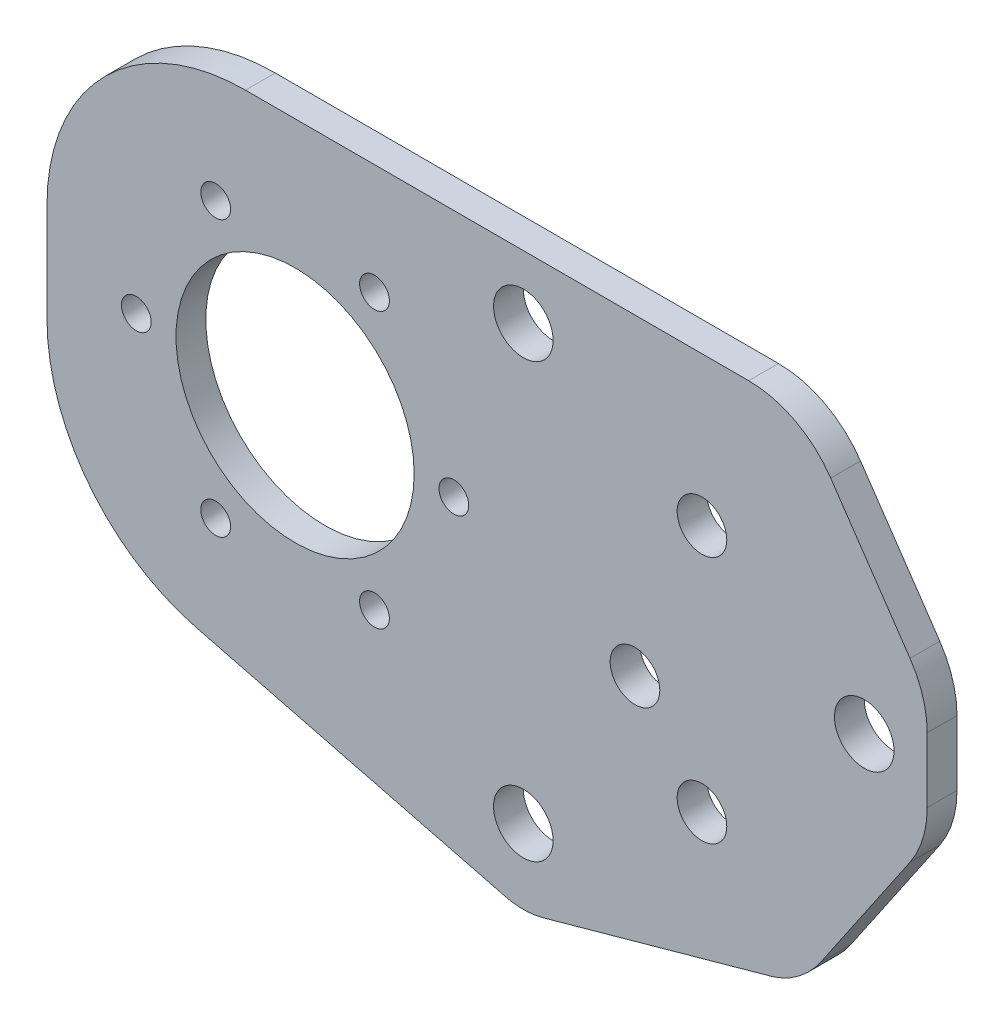
ISO-10303-21;
HEADER;
FILE_DESCRIPTION(('STEP AP214'),'2;1');
FILE_NAME('part.step','',(''),(''),'','','');
FILE_SCHEMA(('AUTOMOTIVE_DESIGN { 1 0 10303 214 1 1 1 1 }'));
ENDSEC;
DATA;
#1=APPLICATION_CONTEXT('core data for automotive mechanical design processes');
#2=APPLICATION_PROTOCOL_DEFINITION('international standard','automotive_design',2000,#1);
#3=PRODUCT_CONTEXT('',#1,'mechanical');
#4=PRODUCT('Part','Part','',(#3));
#5=PRODUCT_RELATED_PRODUCT_CATEGORY('part','',(#4));
#6=PRODUCT_DEFINITION_FORMATION('','',#4);
#7=PRODUCT_DEFINITION_CONTEXT('part definition',#1,'design');
#8=PRODUCT_DEFINITION('design','',#6,#7);
#9=PRODUCT_DEFINITION_SHAPE('','',#8);
#10=(LENGTH_UNIT() NAMED_UNIT(*) SI_UNIT(.MILLI.,.METRE.));
#11=(NAMED_UNIT(*) PLANE_ANGLE_UNIT() SI_UNIT($,.RADIAN.));
#12=(NAMED_UNIT(*) SI_UNIT($,.STERADIAN.) SOLID_ANGLE_UNIT());
#13=UNCERTAINTY_MEASURE_WITH_UNIT(LENGTH_MEASURE(1.E-05),#10,'distance_accuracy_value','');
#14=(GEOMETRIC_REPRESENTATION_CONTEXT(3) GLOBAL_UNCERTAINTY_ASSIGNED_CONTEXT((#13)) GLOBAL_UNIT_ASSIGNED_CONTEXT((#10,
#11,#12)) REPRESENTATION_CONTEXT('',''));
#15=CARTESIAN_POINT('',(0.,0.,0.));
#16=DIRECTION('',(0.,0.,1.));
#17=DIRECTION('',(1.,0.,0.));
#18=AXIS2_PLACEMENT_3D('',#15,#16,#17);
#19=CARTESIAN_POINT('',(20.,20.,3.));
#20=DIRECTION('',(0.,0.,-1.));
#21=DIRECTION('',(-1.,0.,0.));
#22=AXIS2_PLACEMENT_3D('',#19,#20,#21);
#23=CYLINDRICAL_SURFACE('',#22,20.);
#24=CARTESIAN_POINT('',(20.,20.,0.));
#25=DIRECTION('',(0.,0.,-1.));
#26=DIRECTION('',(-1.,0.,0.));
#27=AXIS2_PLACEMENT_3D('',#24,#25,#26);
#28=CIRCLE('',#27,20.);
#29=CARTESIAN_POINT('',(15.0815742554658,0.614203957652305,0.));
#30=VERTEX_POINT('',#29);
#31=CARTESIAN_POINT('',(0.,20.,0.));
#32=VERTEX_POINT('',#31);
#33=EDGE_CURVE('E327',#30,#32,#28,.T.);
#34=ORIENTED_EDGE('',*,*,#33,.F.);
#35=DIRECTION('',(0.,0.,-1.));
#36=VECTOR('',#35,1.);
#37=CARTESIAN_POINT('',(15.0815742554669,0.614203957656406,3.));
#38=LINE('',#37,#36);
#39=CARTESIAN_POINT('',(15.0815742554669,0.614203957656406,3.));
#40=VERTEX_POINT('',#39);
#41=EDGE_CURVE('E258',#40,#30,#38,.T.);
#42=ORIENTED_EDGE('',*,*,#41,.F.);
#43=CARTESIAN_POINT('',(20.,20.,3.));
#44=DIRECTION('',(0.,0.,-1.));
#45=DIRECTION('',(-1.,0.,0.));
#46=AXIS2_PLACEMENT_3D('',#43,#44,#45);
#47=CIRCLE('',#46,20.);
#48=CARTESIAN_POINT('',(0.,20.,3.));
#49=VERTEX_POINT('',#48);
#50=EDGE_CURVE('E336',#49,#40,#47,.F.);
#51=ORIENTED_EDGE('',*,*,#50,.F.);
#52=DIRECTION('',(0.,0.,-1.));
#53=VECTOR('',#52,1.);
#54=CARTESIAN_POINT('',(0.,20.,3.));
#55=LINE('',#54,#53);
#56=EDGE_CURVE('E332',#32,#49,#55,.F.);
#57=ORIENTED_EDGE('',*,*,#56,.F.);
#58=EDGE_LOOP('',(#34,#42,#51,#57));
#59=FACE_BOUND('',#58,.T.);
#60=ADVANCED_FACE('F36',(#59),#23,.T.);
#61=CARTESIAN_POINT('',(0.,0.,3.));
#62=DIRECTION('',(0.,0.,-1.));
#63=DIRECTION('',(-1.,0.,0.));
#64=AXIS2_PLACEMENT_3D('',#61,#62,#63);
#65=PLANE('',#64);
#66=CARTESIAN_POINT('',(66.,35.,3.));
#67=DIRECTION('',(0.,0.,1.));
#68=DIRECTION('',(1.,0.,0.));
#69=AXIS2_PLACEMENT_3D('',#66,#67,#68);
#70=CIRCLE('',#69,2.5);
#71=CARTESIAN_POINT('',(68.5,35.,3.));
#72=VERTEX_POINT('',#71);
#73=EDGE_CURVE('E200',#72,#72,#70,.T.);
#74=ORIENTED_EDGE('',*,*,#73,.F.);
#75=EDGE_LOOP('',(#74));
#76=FACE_BOUND('',#75,.T.);
#77=CARTESIAN_POINT('',(66.,10.,3.));
#78=DIRECTION('',(0.,0.,1.));
#79=DIRECTION('',(1.,0.,0.));
#80=AXIS2_PLACEMENT_3D('',#77,#78,#79);
#81=CIRCLE('',#80,2.5);
#82=CARTESIAN_POINT('',(68.5,10.,3.));
#83=VERTEX_POINT('',#82);
#84=EDGE_CURVE('E206',#83,#83,#81,.T.);
#85=ORIENTED_EDGE('',*,*,#84,.F.);
#86=EDGE_LOOP('',(#85));
#87=FACE_BOUND('',#86,.T.);
#88=CARTESIAN_POINT('',(48.0000000000088,-8.60422844084496E-13,3.));
#89=DIRECTION('',(0.,0.,-1.));
#90=DIRECTION('',(-1.,0.,0.));
#91=AXIS2_PLACEMENT_3D('',#88,#89,#90);
#92=CIRCLE('',#91,3.00000000000781);
#93=CARTESIAN_POINT('',(45.000000000001,-8.60422844084496E-13,3.));
#94=VERTEX_POINT('',#93);
#95=EDGE_CURVE('E234',#94,#94,#92,.T.);
#96=ORIENTED_EDGE('',*,*,#95,.T.);
#97=EDGE_LOOP('',(#96));
#98=FACE_BOUND('',#97,.T.);
#99=CARTESIAN_POINT('',(48.0000000000088,43.6499999999991,3.));
#100=DIRECTION('',(0.,0.,-1.));
#101=DIRECTION('',(-1.,0.,0.));
#102=AXIS2_PLACEMENT_3D('',#99,#100,#101);
#103=CIRCLE('',#102,3.0000000000078);
#104=CARTESIAN_POINT('',(45.000000000001,43.6499999999991,3.));
#105=VERTEX_POINT('',#104);
#106=EDGE_CURVE('E240',#105,#105,#103,.T.);
#107=ORIENTED_EDGE('',*,*,#106,.T.);
#108=EDGE_LOOP('',(#107));
#109=FACE_BOUND('',#108,.T.);
#110=DIRECTION('',(-0.562855404948393,-0.826555378132876,0.));
#111=VECTOR('',#110,1.);
#112=CARTESIAN_POINT('',(51.9227282771489,-35.3575683174151,3.));
#113=LINE('',#112,#111);
#114=CARTESIAN_POINT('',(86.9655537813288,16.1029588993529,3.));
#115=VERTEX_POINT('',#114);
#116=CARTESIAN_POINT('',(77.9793710099416,2.90671412089845,3.));
#117=VERTEX_POINT('',#116);
#118=EDGE_CURVE('E228',#115,#117,#113,.T.);
#119=ORIENTED_EDGE('',*,*,#118,.F.);
#120=CARTESIAN_POINT('',(78.7,21.7315129488368,3.));
#121=DIRECTION('',(0.,0.,-1.));
#122=DIRECTION('',(-1.,0.,0.));
#123=AXIS2_PLACEMENT_3D('',#120,#121,#122);
#124=CIRCLE('',#123,10.);
#125=CARTESIAN_POINT('',(88.7,21.7315129488368,3.));
#126=VERTEX_POINT('',#125);
#127=EDGE_CURVE('E182',#115,#126,#124,.F.);
#128=ORIENTED_EDGE('',*,*,#127,.T.);
#129=DIRECTION('',(0.,-1.,0.));
#130=VECTOR('',#129,1.);
#131=CARTESIAN_POINT('',(88.7,0.,3.));
#132=LINE('',#131,#130);
#133=CARTESIAN_POINT('',(88.7,28.2684870511632,3.));
#134=VERTEX_POINT('',#133);
#135=EDGE_CURVE('E230',#134,#126,#132,.T.);
#136=ORIENTED_EDGE('',*,*,#135,.F.);
#137=CARTESIAN_POINT('',(78.7,28.2684870511632,3.));
#138=DIRECTION('',(0.,0.,-1.));
#139=DIRECTION('',(-1.,0.,0.));
#140=AXIS2_PLACEMENT_3D('',#137,#138,#139);
#141=CIRCLE('',#140,10.);
#142=CARTESIAN_POINT('',(86.9655537813288,33.8970411006471,3.));
#143=VERTEX_POINT('',#142);
#144=EDGE_CURVE('E175',#134,#143,#141,.F.);
#145=ORIENTED_EDGE('',*,*,#144,.T.);
#146=DIRECTION('',(0.562855404948393,-0.826555378132876,0.));
#147=VECTOR('',#146,1.);
#148=CARTESIAN_POINT('',(75.1842863807115,51.1978786613961,3.));
#149=LINE('',#148,#147);
#150=CARTESIAN_POINT('',(78.9768023362764,45.6285540494839,3.));
#151=VERTEX_POINT('',#150);
#152=EDGE_CURVE('E217',#151,#143,#149,.T.);
#153=ORIENTED_EDGE('',*,*,#152,.F.);
#154=CARTESIAN_POINT('',(70.7112485549476,40.,3.));
#155=DIRECTION('',(0.,0.,-1.));
#156=DIRECTION('',(-1.,0.,0.));
#157=AXIS2_PLACEMENT_3D('',#154,#155,#156);
#158=CIRCLE('',#157,10.);
#159=CARTESIAN_POINT('',(70.7112485549476,50.,3.));
#160=VERTEX_POINT('',#159);
#161=EDGE_CURVE('E172',#151,#160,#158,.F.);
#162=ORIENTED_EDGE('',*,*,#161,.T.);
#163=DIRECTION('',(-1.,0.,0.));
#164=VECTOR('',#163,1.);
#165=CARTESIAN_POINT('',(0.,50.,3.));
#166=LINE('',#165,#164);
#167=CARTESIAN_POINT('',(20.,50.,3.));
#168=VERTEX_POINT('',#167);
#169=EDGE_CURVE('E318',#160,#168,#166,.T.);
#170=ORIENTED_EDGE('',*,*,#169,.T.);
#171=CARTESIAN_POINT('',(20.,30.,3.));
#172=DIRECTION('',(0.,0.,-1.));
#173=DIRECTION('',(-1.,0.,0.));
#174=AXIS2_PLACEMENT_3D('',#171,#172,#173);
#175=CIRCLE('',#174,20.);
#176=CARTESIAN_POINT('',(0.,30.,3.));
#177=VERTEX_POINT('',#176);
#178=EDGE_CURVE('E334',#168,#177,#175,.F.);
#179=ORIENTED_EDGE('',*,*,#178,.T.);
#180=DIRECTION('',(0.,-1.,0.));
#181=VECTOR('',#180,1.);
#182=CARTESIAN_POINT('',(0.,0.,3.));
#183=LINE('',#182,#181);
#184=EDGE_CURVE('E315',#177,#49,#183,.T.);
#185=ORIENTED_EDGE('',*,*,#184,.T.);
#186=ORIENTED_EDGE('',*,*,#50,.T.);
#187=DIRECTION('',(-0.969289802117385,0.245921287226708,0.));
#188=VECTOR('',#187,1.);
#189=CARTESIAN_POINT('',(1.05849976234027,4.17203828408016,3.));
#190=LINE('',#189,#188);
#191=CARTESIAN_POINT('',(46.1555903458085,-7.26967351587838,3.));
#192=VERTEX_POINT('',#191);
#193=EDGE_CURVE('E155',#192,#40,#190,.T.);
#194=ORIENTED_EDGE('',*,*,#193,.F.);
#195=CARTESIAN_POINT('',(48.0000000000088,2.00128802418881E-12,3.));
#196=DIRECTION('',(0.,0.,-1.));
#197=DIRECTION('',(-1.,0.,0.));
#198=AXIS2_PLACEMENT_3D('',#195,#196,#197);
#199=CIRCLE('',#198,7.5);
#200=CARTESIAN_POINT('',(50.0089285714372,-7.22593980011388,3.));
#201=VERTEX_POINT('',#200);
#202=EDGE_CURVE('E246',#201,#192,#199,.T.);
#203=ORIENTED_EDGE('',*,*,#202,.F.);
#204=DIRECTION('',(-0.96345864001545,-0.26785714285712,0.));
#205=VECTOR('',#204,1.);
#206=CARTESIAN_POINT('',(5.45280612244835,-19.6132651717425,3.));
#207=LINE('',#206,#205);
#208=CARTESIAN_POINT('',(73.1058856947377,-0.804610760352011,3.));
#209=VERTEX_POINT('',#208);
#210=EDGE_CURVE('E166',#209,#201,#207,.T.);
#211=ORIENTED_EDGE('',*,*,#210,.F.);
#212=CARTESIAN_POINT('',(70.3512527980429,7.87798204557463,3.));
#213=DIRECTION('',(0.,0.,-1.));
#214=DIRECTION('',(-1.,0.,0.));
#215=AXIS2_PLACEMENT_3D('',#212,#213,#214);
#216=CIRCLE('',#215,9.10908448907366);
#217=CARTESIAN_POINT('',(74.9243063860392,0.,3.));
#218=VERTEX_POINT('',#217);
#219=EDGE_CURVE('E149',#218,#209,#216,.T.);
#220=ORIENTED_EDGE('',*,*,#219,.F.);
#221=CARTESIAN_POINT('',(69.7138172286128,8.53526817038237,3.));
#222=DIRECTION('',(0.,0.,-1.));
#223=DIRECTION('',(-1.,0.,0.));
#224=AXIS2_PLACEMENT_3D('',#221,#222,#223);
#225=CIRCLE('',#224,10.);
#226=EDGE_CURVE('E162',#218,#117,#225,.F.);
#227=ORIENTED_EDGE('',*,*,#226,.T.);
#228=EDGE_LOOP('',(#119,#128,#136,#145,#153,#162,#170,#179,#185,#186,#194,#203,#211,#220,#227));
#229=FACE_BOUND('',#228,.T.);
#230=CARTESIAN_POINT('',(25.,25.,3.));
#231=DIRECTION('',(0.,0.,1.));
#232=DIRECTION('',(1.,0.,0.));
#233=AXIS2_PLACEMENT_3D('',#230,#231,#232);
#234=CIRCLE('',#233,12.);
#235=CARTESIAN_POINT('',(37.,25.,3.));
#236=VERTEX_POINT('',#235);
#237=EDGE_CURVE('E309',#236,#236,#234,.T.);
#238=ORIENTED_EDGE('',*,*,#237,.F.);
#239=EDGE_LOOP('',(#238));
#240=FACE_BOUND('',#239,.T.);
#241=CARTESIAN_POINT('',(59.25,18.5,3.));
#242=DIRECTION('',(0.,0.,1.));
#243=DIRECTION('',(1.,0.,0.));
#244=AXIS2_PLACEMENT_3D('',#241,#242,#243);
#245=CIRCLE('',#244,2.5);
#246=CARTESIAN_POINT('',(61.75,18.5,3.));
#247=VERTEX_POINT('',#246);
#248=EDGE_CURVE('E303',#247,#247,#245,.T.);
#249=ORIENTED_EDGE('',*,*,#248,.F.);
#250=EDGE_LOOP('',(#249));
#251=FACE_BOUND('',#250,.T.);
#252=CARTESIAN_POINT('',(17.,38.856406460551,3.));
#253=DIRECTION('',(0.,0.,1.));
#254=DIRECTION('',(1.,0.,0.));
#255=AXIS2_PLACEMENT_3D('',#252,#253,#254);
#256=CIRCLE('',#255,1.5);
#257=CARTESIAN_POINT('',(18.5,38.856406460551,3.));
#258=VERTEX_POINT('',#257);
#259=EDGE_CURVE('E297',#258,#258,#256,.T.);
#260=ORIENTED_EDGE('',*,*,#259,.F.);
#261=EDGE_LOOP('',(#260));
#262=FACE_BOUND('',#261,.T.);
#263=CARTESIAN_POINT('',(33.,38.856406460551,3.));
#264=DIRECTION('',(0.,0.,1.));
#265=DIRECTION('',(1.,0.,0.));
#266=AXIS2_PLACEMENT_3D('',#263,#264,#265);
#267=CIRCLE('',#266,1.5);
#268=CARTESIAN_POINT('',(34.5,38.856406460551,3.));
#269=VERTEX_POINT('',#268);
#270=EDGE_CURVE('E291',#269,#269,#267,.T.);
#271=ORIENTED_EDGE('',*,*,#270,.F.);
#272=EDGE_LOOP('',(#271));
#273=FACE_BOUND('',#272,.T.);
#274=CARTESIAN_POINT('',(41.,25.,3.));
#275=DIRECTION('',(0.,0.,1.));
#276=DIRECTION('',(1.,0.,0.));
#277=AXIS2_PLACEMENT_3D('',#274,#275,#276);
#278=CIRCLE('',#277,1.5);
#279=CARTESIAN_POINT('',(42.5,25.,3.));
#280=VERTEX_POINT('',#279);
#281=EDGE_CURVE('E285',#280,#280,#278,.T.);
#282=ORIENTED_EDGE('',*,*,#281,.F.);
#283=EDGE_LOOP('',(#282));
#284=FACE_BOUND('',#283,.T.);
#285=CARTESIAN_POINT('',(33.,11.143593539449,3.));
#286=DIRECTION('',(0.,0.,1.));
#287=DIRECTION('',(1.,0.,0.));
#288=AXIS2_PLACEMENT_3D('',#285,#286,#287);
#289=CIRCLE('',#288,1.5);
#290=CARTESIAN_POINT('',(34.5,11.143593539449,3.));
#291=VERTEX_POINT('',#290);
#292=EDGE_CURVE('E279',#291,#291,#289,.T.);
#293=ORIENTED_EDGE('',*,*,#292,.F.);
#294=EDGE_LOOP('',(#293));
#295=FACE_BOUND('',#294,.T.);
#296=CARTESIAN_POINT('',(17.,11.143593539449,3.));
#297=DIRECTION('',(0.,0.,1.));
#298=DIRECTION('',(1.,0.,0.));
#299=AXIS2_PLACEMENT_3D('',#296,#297,#298);
#300=CIRCLE('',#299,1.49999999999999);
#301=CARTESIAN_POINT('',(18.5,11.143593539449,3.));
#302=VERTEX_POINT('',#301);
#303=EDGE_CURVE('E273',#302,#302,#300,.T.);
#304=ORIENTED_EDGE('',*,*,#303,.F.);
#305=EDGE_LOOP('',(#304));
#306=FACE_BOUND('',#305,.T.);
#307=CARTESIAN_POINT('',(9.,25.,3.));
#308=DIRECTION('',(0.,0.,1.));
#309=DIRECTION('',(1.,0.,0.));
#310=AXIS2_PLACEMENT_3D('',#307,#308,#309);
#311=CIRCLE('',#310,1.5);
#312=CARTESIAN_POINT('',(10.5,25.,3.));
#313=VERTEX_POINT('',#312);
#314=EDGE_CURVE('E267',#313,#313,#311,.T.);
#315=ORIENTED_EDGE('',*,*,#314,.F.);
#316=EDGE_LOOP('',(#315));
#317=FACE_BOUND('',#316,.T.);
#318=CARTESIAN_POINT('',(82.35,25.,3.));
#319=DIRECTION('',(0.,0.,1.));
#320=DIRECTION('',(1.,0.,0.));
#321=AXIS2_PLACEMENT_3D('',#318,#319,#320);
#322=CIRCLE('',#321,3.00000000000001);
#323=CARTESIAN_POINT('',(85.35,25.,3.));
#324=VERTEX_POINT('',#323);
#325=EDGE_CURVE('E204',#324,#324,#322,.T.);
#326=ORIENTED_EDGE('',*,*,#325,.F.);
#327=EDGE_LOOP('',(#326));
#328=FACE_BOUND('',#327,.T.);
#329=ADVANCED_FACE('F160',(#76,#87,#98,#109,#229,#240,#251,#262,#273,#284,#295,#306,#317,#328),
#65,.F.);
#330=CARTESIAN_POINT('',(0.,0.,0.));
#331=DIRECTION('',(0.,0.,-1.));
#332=DIRECTION('',(-1.,0.,0.));
#333=AXIS2_PLACEMENT_3D('',#330,#331,#332);
#334=PLANE('',#333);
#335=CARTESIAN_POINT('',(66.,35.,0.));
#336=DIRECTION('',(0.,0.,-1.));
#337=DIRECTION('',(-1.,0.,0.));
#338=AXIS2_PLACEMENT_3D('',#335,#336,#337);
#339=CIRCLE('',#338,2.5);
#340=CARTESIAN_POINT('',(63.5,35.,0.));
#341=VERTEX_POINT('',#340);
#342=EDGE_CURVE('E40',#341,#341,#339,.T.);
#343=ORIENTED_EDGE('',*,*,#342,.F.);
#344=EDGE_LOOP('',(#343));
#345=FACE_BOUND('',#344,.T.);
#346=CARTESIAN_POINT('',(66.,10.,0.));
#347=DIRECTION('',(0.,0.,-1.));
#348=DIRECTION('',(-1.,0.,0.));
#349=AXIS2_PLACEMENT_3D('',#346,#347,#348);
#350=CIRCLE('',#349,2.5);
#351=CARTESIAN_POINT('',(63.5,10.,0.));
#352=VERTEX_POINT('',#351);
#353=EDGE_CURVE('E198',#352,#352,#350,.T.);
#354=ORIENTED_EDGE('',*,*,#353,.F.);
#355=EDGE_LOOP('',(#354));
#356=FACE_BOUND('',#355,.T.);
#357=CARTESIAN_POINT('',(48.0000000000088,-8.60422844084496E-13,0.));
#358=DIRECTION('',(0.,0.,-1.));
#359=DIRECTION('',(-1.,0.,0.));
#360=AXIS2_PLACEMENT_3D('',#357,#358,#359);
#361=CIRCLE('',#360,3.00000000000781);
#362=CARTESIAN_POINT('',(45.000000000001,-8.60422844084496E-13,0.));
#363=VERTEX_POINT('',#362);
#364=EDGE_CURVE('E237',#363,#363,#361,.T.);
#365=ORIENTED_EDGE('',*,*,#364,.F.);
#366=EDGE_LOOP('',(#365));
#367=FACE_BOUND('',#366,.T.);
#368=CARTESIAN_POINT('',(48.0000000000088,43.6499999999991,0.));
#369=DIRECTION('',(0.,0.,-1.));
#370=DIRECTION('',(-1.,0.,0.));
#371=AXIS2_PLACEMENT_3D('',#368,#369,#370);
#372=CIRCLE('',#371,3.0000000000078);
#373=CARTESIAN_POINT('',(45.000000000001,43.6499999999991,0.));
#374=VERTEX_POINT('',#373);
#375=EDGE_CURVE('E225',#374,#374,#372,.T.);
#376=ORIENTED_EDGE('',*,*,#375,.F.);
#377=EDGE_LOOP('',(#376));
#378=FACE_BOUND('',#377,.T.);
#379=DIRECTION('',(0.,-1.,0.));
#380=VECTOR('',#379,1.);
#381=CARTESIAN_POINT('',(88.7,0.,0.));
#382=LINE('',#381,#380);
#383=CARTESIAN_POINT('',(88.7,28.2684870511632,0.));
#384=VERTEX_POINT('',#383);
#385=CARTESIAN_POINT('',(88.7,21.7315129488368,0.));
#386=VERTEX_POINT('',#385);
#387=EDGE_CURVE('E220',#384,#386,#382,.T.);
#388=ORIENTED_EDGE('',*,*,#387,.T.);
#389=CARTESIAN_POINT('',(78.7,21.7315129488368,0.));
#390=DIRECTION('',(0.,0.,-1.));
#391=DIRECTION('',(-1.,0.,0.));
#392=AXIS2_PLACEMENT_3D('',#389,#390,#391);
#393=CIRCLE('',#392,10.);
#394=CARTESIAN_POINT('',(86.9655537813288,16.1029588993529,0.));
#395=VERTEX_POINT('',#394);
#396=EDGE_CURVE('E194',#386,#395,#393,.T.);
#397=ORIENTED_EDGE('',*,*,#396,.T.);
#398=DIRECTION('',(-0.562855404948393,-0.826555378132876,0.));
#399=VECTOR('',#398,1.);
#400=CARTESIAN_POINT('',(51.9227282771489,-35.3575683174151,0.));
#401=LINE('',#400,#399);
#402=CARTESIAN_POINT('',(77.9793710099416,2.90671412089845,0.));
#403=VERTEX_POINT('',#402);
#404=EDGE_CURVE('E216',#395,#403,#401,.T.);
#405=ORIENTED_EDGE('',*,*,#404,.T.);
#406=CARTESIAN_POINT('',(69.7138172286128,8.53526817038237,0.));
#407=DIRECTION('',(0.,0.,-1.));
#408=DIRECTION('',(-1.,0.,0.));
#409=AXIS2_PLACEMENT_3D('',#406,#407,#408);
#410=CIRCLE('',#409,10.);
#411=CARTESIAN_POINT('',(74.9243063860392,0.,0.));
#412=VERTEX_POINT('',#411);
#413=EDGE_CURVE('E189',#403,#412,#410,.T.);
#414=ORIENTED_EDGE('',*,*,#413,.T.);
#415=CARTESIAN_POINT('',(70.3512527980429,7.87798204557463,0.));
#416=DIRECTION('',(0.,0.,-1.));
#417=DIRECTION('',(-1.,0.,0.));
#418=AXIS2_PLACEMENT_3D('',#415,#416,#417);
#419=CIRCLE('',#418,9.10908448907366);
#420=CARTESIAN_POINT('',(73.1058856947377,-0.804610760352011,0.));
#421=VERTEX_POINT('',#420);
#422=EDGE_CURVE('E151',#412,#421,#419,.T.);
#423=ORIENTED_EDGE('',*,*,#422,.T.);
#424=DIRECTION('',(-0.96345864001545,-0.26785714285712,0.));
#425=VECTOR('',#424,1.);
#426=CARTESIAN_POINT('',(5.45280612244835,-19.6132651717425,0.));
#427=LINE('',#426,#425);
#428=CARTESIAN_POINT('',(50.0089285714372,-7.22593980011388,0.));
#429=VERTEX_POINT('',#428);
#430=EDGE_CURVE('E251',#421,#429,#427,.T.);
#431=ORIENTED_EDGE('',*,*,#430,.T.);
#432=CARTESIAN_POINT('',(48.0000000000088,2.00128802418881E-12,0.));
#433=DIRECTION('',(0.,0.,-1.));
#434=DIRECTION('',(-1.,0.,0.));
#435=AXIS2_PLACEMENT_3D('',#432,#433,#434);
#436=CIRCLE('',#435,7.5);
#437=CARTESIAN_POINT('',(46.1555903458085,-7.26967351587838,0.));
#438=VERTEX_POINT('',#437);
#439=EDGE_CURVE('E254',#429,#438,#436,.T.);
#440=ORIENTED_EDGE('',*,*,#439,.T.);
#441=DIRECTION('',(-0.969289802117385,0.245921287226708,0.));
#442=VECTOR('',#441,1.);
#443=CARTESIAN_POINT('',(1.05849976234027,4.17203828408016,0.));
#444=LINE('',#443,#442);
#445=EDGE_CURVE('E167',#438,#30,#444,.T.);
#446=ORIENTED_EDGE('',*,*,#445,.T.);
#447=ORIENTED_EDGE('',*,*,#33,.T.);
#448=DIRECTION('',(0.,-1.,0.));
#449=VECTOR('',#448,1.);
#450=CARTESIAN_POINT('',(0.,0.,0.));
#451=LINE('',#450,#449);
#452=CARTESIAN_POINT('',(0.,30.,0.));
#453=VERTEX_POINT('',#452);
#454=EDGE_CURVE('E312',#453,#32,#451,.T.);
#455=ORIENTED_EDGE('',*,*,#454,.F.);
#456=CARTESIAN_POINT('',(20.,30.,0.));
#457=DIRECTION('',(0.,0.,-1.));
#458=DIRECTION('',(-1.,0.,0.));
#459=AXIS2_PLACEMENT_3D('',#456,#457,#458);
#460=CIRCLE('',#459,20.);
#461=CARTESIAN_POINT('',(20.,50.,0.));
#462=VERTEX_POINT('',#461);
#463=EDGE_CURVE('E321',#453,#462,#460,.T.);
#464=ORIENTED_EDGE('',*,*,#463,.T.);
#465=DIRECTION('',(-1.,0.,0.));
#466=VECTOR('',#465,1.);
#467=CARTESIAN_POINT('',(0.,50.,0.));
#468=LINE('',#467,#466);
#469=CARTESIAN_POINT('',(70.7112485549476,50.,0.));
#470=VERTEX_POINT('',#469);
#471=EDGE_CURVE('E319',#470,#462,#468,.T.);
#472=ORIENTED_EDGE('',*,*,#471,.F.);
#473=CARTESIAN_POINT('',(70.7112485549476,40.,0.));
#474=DIRECTION('',(0.,0.,-1.));
#475=DIRECTION('',(-1.,0.,0.));
#476=AXIS2_PLACEMENT_3D('',#473,#474,#475);
#477=CIRCLE('',#476,10.);
#478=CARTESIAN_POINT('',(78.9768023362764,45.6285540494839,0.));
#479=VERTEX_POINT('',#478);
#480=EDGE_CURVE('E59',#470,#479,#477,.T.);
#481=ORIENTED_EDGE('',*,*,#480,.T.);
#482=DIRECTION('',(0.562855404948393,-0.826555378132876,0.));
#483=VECTOR('',#482,1.);
#484=CARTESIAN_POINT('',(75.1842863807115,51.1978786613961,0.));
#485=LINE('',#484,#483);
#486=CARTESIAN_POINT('',(86.9655537813288,33.8970411006471,0.));
#487=VERTEX_POINT('',#486);
#488=EDGE_CURVE('E223',#479,#487,#485,.T.);
#489=ORIENTED_EDGE('',*,*,#488,.T.);
#490=CARTESIAN_POINT('',(78.7,28.2684870511632,0.));
#491=DIRECTION('',(0.,0.,-1.));
#492=DIRECTION('',(-1.,0.,0.));
#493=AXIS2_PLACEMENT_3D('',#490,#491,#492);
#494=CIRCLE('',#493,10.);
#495=EDGE_CURVE('E192',#487,#384,#494,.T.);
#496=ORIENTED_EDGE('',*,*,#495,.T.);
#497=EDGE_LOOP('',(#388,#397,#405,#414,#423,#431,#440,#446,#447,#455,#464,#472,#481,#489,#496));
#498=FACE_BOUND('',#497,.T.);
#499=CARTESIAN_POINT('',(17.,11.143593539449,0.));
#500=DIRECTION('',(0.,0.,1.));
#501=DIRECTION('',(1.,0.,0.));
#502=AXIS2_PLACEMENT_3D('',#499,#500,#501);
#503=CIRCLE('',#502,1.49999999999999);
#504=CARTESIAN_POINT('',(18.5,11.143593539449,0.));
#505=VERTEX_POINT('',#504);
#506=EDGE_CURVE('E270',#505,#505,#503,.T.);
#507=ORIENTED_EDGE('',*,*,#506,.T.);
#508=EDGE_LOOP('',(#507));
#509=FACE_BOUND('',#508,.T.);
#510=CARTESIAN_POINT('',(41.,25.,0.));
#511=DIRECTION('',(0.,0.,1.));
#512=DIRECTION('',(1.,0.,0.));
#513=AXIS2_PLACEMENT_3D('',#510,#511,#512);
#514=CIRCLE('',#513,1.5);
#515=CARTESIAN_POINT('',(42.5,25.,0.));
#516=VERTEX_POINT('',#515);
#517=EDGE_CURVE('E282',#516,#516,#514,.T.);
#518=ORIENTED_EDGE('',*,*,#517,.T.);
#519=EDGE_LOOP('',(#518));
#520=FACE_BOUND('',#519,.T.);
#521=CARTESIAN_POINT('',(17.,38.856406460551,0.));
#522=DIRECTION('',(0.,0.,1.));
#523=DIRECTION('',(1.,0.,0.));
#524=AXIS2_PLACEMENT_3D('',#521,#522,#523);
#525=CIRCLE('',#524,1.5);
#526=CARTESIAN_POINT('',(18.5,38.856406460551,0.));
#527=VERTEX_POINT('',#526);
#528=EDGE_CURVE('E294',#527,#527,#525,.T.);
#529=ORIENTED_EDGE('',*,*,#528,.T.);
#530=EDGE_LOOP('',(#529));
#531=FACE_BOUND('',#530,.T.);
#532=CARTESIAN_POINT('',(25.,25.,0.));
#533=DIRECTION('',(0.,0.,1.));
#534=DIRECTION('',(1.,0.,0.));
#535=AXIS2_PLACEMENT_3D('',#532,#533,#534);
#536=CIRCLE('',#535,12.);
#537=CARTESIAN_POINT('',(37.,25.,0.));
#538=VERTEX_POINT('',#537);
#539=EDGE_CURVE('E306',#538,#538,#536,.T.);
#540=ORIENTED_EDGE('',*,*,#539,.T.);
#541=EDGE_LOOP('',(#540));
#542=FACE_BOUND('',#541,.T.);
#543=CARTESIAN_POINT('',(59.25,18.5,0.));
#544=DIRECTION('',(0.,0.,1.));
#545=DIRECTION('',(1.,0.,0.));
#546=AXIS2_PLACEMENT_3D('',#543,#544,#545);
#547=CIRCLE('',#546,2.5);
#548=CARTESIAN_POINT('',(61.75,18.5,0.));
#549=VERTEX_POINT('',#548);
#550=EDGE_CURVE('E300',#549,#549,#547,.T.);
#551=ORIENTED_EDGE('',*,*,#550,.T.);
#552=EDGE_LOOP('',(#551));
#553=FACE_BOUND('',#552,.T.);
#554=CARTESIAN_POINT('',(33.,38.856406460551,0.));
#555=DIRECTION('',(0.,0.,1.));
#556=DIRECTION('',(1.,0.,0.));
#557=AXIS2_PLACEMENT_3D('',#554,#555,#556);
#558=CIRCLE('',#557,1.5);
#559=CARTESIAN_POINT('',(34.5,38.856406460551,0.));
#560=VERTEX_POINT('',#559);
#561=EDGE_CURVE('E288',#560,#560,#558,.T.);
#562=ORIENTED_EDGE('',*,*,#561,.T.);
#563=EDGE_LOOP('',(#562));
#564=FACE_BOUND('',#563,.T.);
#565=CARTESIAN_POINT('',(33.,11.143593539449,0.));
#566=DIRECTION('',(0.,0.,1.));
#567=DIRECTION('',(1.,0.,0.));
#568=AXIS2_PLACEMENT_3D('',#565,#566,#567);
#569=CIRCLE('',#568,1.5);
#570=CARTESIAN_POINT('',(34.5,11.143593539449,0.));
#571=VERTEX_POINT('',#570);
#572=EDGE_CURVE('E276',#571,#571,#569,.T.);
#573=ORIENTED_EDGE('',*,*,#572,.T.);
#574=EDGE_LOOP('',(#573));
#575=FACE_BOUND('',#574,.T.);
#576=CARTESIAN_POINT('',(9.,25.,0.));
#577=DIRECTION('',(0.,0.,1.));
#578=DIRECTION('',(1.,0.,0.));
#579=AXIS2_PLACEMENT_3D('',#576,#577,#578);
#580=CIRCLE('',#579,1.5);
#581=CARTESIAN_POINT('',(10.5,25.,0.));
#582=VERTEX_POINT('',#581);
#583=EDGE_CURVE('E261',#582,#582,#580,.T.);
#584=ORIENTED_EDGE('',*,*,#583,.T.);
#585=EDGE_LOOP('',(#584));
#586=FACE_BOUND('',#585,.T.);
#587=CARTESIAN_POINT('',(82.35,25.,0.));
#588=DIRECTION('',(0.,0.,1.));
#589=DIRECTION('',(1.,0.,0.));
#590=AXIS2_PLACEMENT_3D('',#587,#588,#589);
#591=CIRCLE('',#590,3.00000000000001);
#592=CARTESIAN_POINT('',(85.35,25.,0.));
#593=VERTEX_POINT('',#592);
#594=EDGE_CURVE('E213',#593,#593,#591,.T.);
#595=ORIENTED_EDGE('',*,*,#594,.T.);
#596=EDGE_LOOP('',(#595));
#597=FACE_BOUND('',#596,.T.);
#598=ADVANCED_FACE('F345',(#345,#356,#367,#378,#498,#509,#520,#531,#542,#553,#564,#575,#586,
#597),#334,.T.);
#599=CARTESIAN_POINT('',(0.,0.,3.));
#600=DIRECTION('',(1.,0.,0.));
#601=DIRECTION('',(0.,0.,-1.));
#602=AXIS2_PLACEMENT_3D('',#599,#600,#601);
#603=PLANE('',#602);
#604=ORIENTED_EDGE('',*,*,#454,.T.);
#605=ORIENTED_EDGE('',*,*,#56,.T.);
#606=ORIENTED_EDGE('',*,*,#184,.F.);
#607=DIRECTION('',(0.,0.,-1.));
#608=VECTOR('',#607,1.);
#609=CARTESIAN_POINT('',(0.,30.,3.));
#610=LINE('',#609,#608);
#611=EDGE_CURVE('E329',#177,#453,#610,.T.);
#612=ORIENTED_EDGE('',*,*,#611,.T.);
#613=EDGE_LOOP('',(#604,#605,#606,#612));
#614=FACE_BOUND('',#613,.T.);
#615=ADVANCED_FACE('F377',(#614),#603,.F.);
#616=CARTESIAN_POINT('',(0.,50.,3.));
#617=DIRECTION('',(0.,-1.,0.));
#618=DIRECTION('',(0.,0.,-1.));
#619=AXIS2_PLACEMENT_3D('',#616,#617,#618);
#620=PLANE('',#619);
#621=ORIENTED_EDGE('',*,*,#169,.F.);
#622=DIRECTION('',(0.,0.,-1.));
#623=VECTOR('',#622,1.);
#624=CARTESIAN_POINT('',(70.7112485549476,50.,3.));
#625=LINE('',#624,#623);
#626=EDGE_CURVE('E11',#160,#470,#625,.T.);
#627=ORIENTED_EDGE('',*,*,#626,.T.);
#628=ORIENTED_EDGE('',*,*,#471,.T.);
#629=DIRECTION('',(0.,0.,-1.));
#630=VECTOR('',#629,1.);
#631=CARTESIAN_POINT('',(20.,50.,3.));
#632=LINE('',#631,#630);
#633=EDGE_CURVE('E339',#462,#168,#632,.F.);
#634=ORIENTED_EDGE('',*,*,#633,.T.);
#635=EDGE_LOOP('',(#621,#627,#628,#634));
#636=FACE_BOUND('',#635,.T.);
#637=ADVANCED_FACE('F368',(#636),#620,.F.);
#638=CARTESIAN_POINT('',(25.,25.,3.));
#639=DIRECTION('',(0.,0.,-1.));
#640=DIRECTION('',(-1.,0.,0.));
#641=AXIS2_PLACEMENT_3D('',#638,#639,#640);
#642=CYLINDRICAL_SURFACE('',#641,12.);
#643=ORIENTED_EDGE('',*,*,#237,.T.);
#644=EDGE_LOOP('',(#643));
#645=FACE_BOUND('',#644,.T.);
#646=ORIENTED_EDGE('',*,*,#539,.F.);
#647=EDGE_LOOP('',(#646));
#648=FACE_BOUND('',#647,.T.);
#649=ADVANCED_FACE('F467',(#645,#648),#642,.F.);
#650=CARTESIAN_POINT('',(59.25,18.5,3.));
#651=DIRECTION('',(0.,0.,-1.));
#652=DIRECTION('',(-1.,0.,0.));
#653=AXIS2_PLACEMENT_3D('',#650,#651,#652);
#654=CYLINDRICAL_SURFACE('',#653,2.5);
#655=ORIENTED_EDGE('',*,*,#248,.T.);
#656=EDGE_LOOP('',(#655));
#657=FACE_BOUND('',#656,.T.);
#658=ORIENTED_EDGE('',*,*,#550,.F.);
#659=EDGE_LOOP('',(#658));
#660=FACE_BOUND('',#659,.T.);
#661=ADVANCED_FACE('F471',(#657,#660),#654,.F.);
#662=CARTESIAN_POINT('',(17.,38.856406460551,3.));
#663=DIRECTION('',(0.,0.,-1.));
#664=DIRECTION('',(-1.,0.,0.));
#665=AXIS2_PLACEMENT_3D('',#662,#663,#664);
#666=CYLINDRICAL_SURFACE('',#665,1.5);
#667=ORIENTED_EDGE('',*,*,#259,.T.);
#668=EDGE_LOOP('',(#667));
#669=FACE_BOUND('',#668,.T.);
#670=ORIENTED_EDGE('',*,*,#528,.F.);
#671=EDGE_LOOP('',(#670));
#672=FACE_BOUND('',#671,.T.);
#673=ADVANCED_FACE('F476',(#669,#672),#666,.F.);
#674=CARTESIAN_POINT('',(33.,38.856406460551,3.));
#675=DIRECTION('',(0.,0.,-1.));
#676=DIRECTION('',(-1.,0.,0.));
#677=AXIS2_PLACEMENT_3D('',#674,#675,#676);
#678=CYLINDRICAL_SURFACE('',#677,1.5);
#679=ORIENTED_EDGE('',*,*,#270,.T.);
#680=EDGE_LOOP('',(#679));
#681=FACE_BOUND('',#680,.T.);
#682=ORIENTED_EDGE('',*,*,#561,.F.);
#683=EDGE_LOOP('',(#682));
#684=FACE_BOUND('',#683,.T.);
#685=ADVANCED_FACE('F483',(#681,#684),#678,.F.);
#686=CARTESIAN_POINT('',(41.,25.,3.));
#687=DIRECTION('',(0.,0.,-1.));
#688=DIRECTION('',(-1.,0.,0.));
#689=AXIS2_PLACEMENT_3D('',#686,#687,#688);
#690=CYLINDRICAL_SURFACE('',#689,1.5);
#691=ORIENTED_EDGE('',*,*,#281,.T.);
#692=EDGE_LOOP('',(#691));
#693=FACE_BOUND('',#692,.T.);
#694=ORIENTED_EDGE('',*,*,#517,.F.);
#695=EDGE_LOOP('',(#694));
#696=FACE_BOUND('',#695,.T.);
#697=ADVANCED_FACE('F487',(#693,#696),#690,.F.);
#698=CARTESIAN_POINT('',(33.,11.143593539449,3.));
#699=DIRECTION('',(0.,0.,-1.));
#700=DIRECTION('',(-1.,0.,0.));
#701=AXIS2_PLACEMENT_3D('',#698,#699,#700);
#702=CYLINDRICAL_SURFACE('',#701,1.5);
#703=ORIENTED_EDGE('',*,*,#292,.T.);
#704=EDGE_LOOP('',(#703));
#705=FACE_BOUND('',#704,.T.);
#706=ORIENTED_EDGE('',*,*,#572,.F.);
#707=EDGE_LOOP('',(#706));
#708=FACE_BOUND('',#707,.T.);
#709=ADVANCED_FACE('F491',(#705,#708),#702,.F.);
#710=CARTESIAN_POINT('',(17.,11.143593539449,3.));
#711=DIRECTION('',(0.,0.,-1.));
#712=DIRECTION('',(-1.,0.,0.));
#713=AXIS2_PLACEMENT_3D('',#710,#711,#712);
#714=CYLINDRICAL_SURFACE('',#713,1.49999999999999);
#715=ORIENTED_EDGE('',*,*,#303,.T.);
#716=EDGE_LOOP('',(#715));
#717=FACE_BOUND('',#716,.T.);
#718=ORIENTED_EDGE('',*,*,#506,.F.);
#719=EDGE_LOOP('',(#718));
#720=FACE_BOUND('',#719,.T.);
#721=ADVANCED_FACE('F495',(#717,#720),#714,.F.);
#722=CARTESIAN_POINT('',(9.,25.,3.));
#723=DIRECTION('',(0.,0.,-1.));
#724=DIRECTION('',(-1.,0.,0.));
#725=AXIS2_PLACEMENT_3D('',#722,#723,#724);
#726=CYLINDRICAL_SURFACE('',#725,1.5);
#727=ORIENTED_EDGE('',*,*,#314,.T.);
#728=EDGE_LOOP('',(#727));
#729=FACE_BOUND('',#728,.T.);
#730=ORIENTED_EDGE('',*,*,#583,.F.);
#731=EDGE_LOOP('',(#730));
#732=FACE_BOUND('',#731,.T.);
#733=ADVANCED_FACE('F400',(#729,#732),#726,.F.);
#734=CARTESIAN_POINT('',(20.,30.,3.));
#735=DIRECTION('',(0.,0.,-1.));
#736=DIRECTION('',(-1.,0.,0.));
#737=AXIS2_PLACEMENT_3D('',#734,#735,#736);
#738=CYLINDRICAL_SURFACE('',#737,20.);
#739=ORIENTED_EDGE('',*,*,#178,.F.);
#740=ORIENTED_EDGE('',*,*,#633,.F.);
#741=ORIENTED_EDGE('',*,*,#463,.F.);
#742=ORIENTED_EDGE('',*,*,#611,.F.);
#743=EDGE_LOOP('',(#739,#740,#741,#742));
#744=FACE_BOUND('',#743,.T.);
#745=ADVANCED_FACE('F373',(#744),#738,.T.);
#746=CARTESIAN_POINT('',(1.05849976234027,4.17203828408016,3.));
#747=DIRECTION('',(-0.245921287226708,-0.969289802117385,0.));
#748=DIRECTION('',(0.969289802117385,-0.245921287226708,0.));
#749=AXIS2_PLACEMENT_3D('',#746,#747,#748);
#750=PLANE('',#749);
#751=ORIENTED_EDGE('',*,*,#445,.F.);
#752=DIRECTION('',(0.,0.,-1.));
#753=VECTOR('',#752,1.);
#754=CARTESIAN_POINT('',(46.1555903458085,-7.26967351587838,3.));
#755=LINE('',#754,#753);
#756=EDGE_CURVE('E262',#192,#438,#755,.T.);
#757=ORIENTED_EDGE('',*,*,#756,.F.);
#758=ORIENTED_EDGE('',*,*,#193,.T.);
#759=ORIENTED_EDGE('',*,*,#41,.T.);
#760=EDGE_LOOP('',(#751,#757,#758,#759));
#761=FACE_BOUND('',#760,.T.);
#762=ADVANCED_FACE('F392',(#761),#750,.T.);
#763=CARTESIAN_POINT('',(48.0000000000088,2.00128802418881E-12,3.));
#764=DIRECTION('',(0.,0.,-1.));
#765=DIRECTION('',(-1.,0.,0.));
#766=AXIS2_PLACEMENT_3D('',#763,#764,#765);
#767=CYLINDRICAL_SURFACE('',#766,7.5);
#768=ORIENTED_EDGE('',*,*,#439,.F.);
#769=DIRECTION('',(0.,0.,-1.));
#770=VECTOR('',#769,1.);
#771=CARTESIAN_POINT('',(50.0089285714372,-7.22593980011388,3.));
#772=LINE('',#771,#770);
#773=EDGE_CURVE('E264',#201,#429,#772,.T.);
#774=ORIENTED_EDGE('',*,*,#773,.F.);
#775=ORIENTED_EDGE('',*,*,#202,.T.);
#776=ORIENTED_EDGE('',*,*,#756,.T.);
#777=EDGE_LOOP('',(#768,#774,#775,#776));
#778=FACE_BOUND('',#777,.T.);
#779=ADVANCED_FACE('F387',(#778),#767,.T.);
#780=CARTESIAN_POINT('',(5.45280612244835,-19.6132651717425,3.));
#781=DIRECTION('',(0.26785714285712,-0.96345864001545,0.));
#782=DIRECTION('',(0.96345864001545,0.26785714285712,0.));
#783=AXIS2_PLACEMENT_3D('',#780,#781,#782);
#784=PLANE('',#783);
#785=ORIENTED_EDGE('',*,*,#430,.F.);
#786=DIRECTION('',(0.,0.,-1.));
#787=VECTOR('',#786,1.);
#788=CARTESIAN_POINT('',(73.1058856947377,-0.804610760352011,3.));
#789=LINE('',#788,#787);
#790=EDGE_CURVE('E154',#209,#421,#789,.T.);
#791=ORIENTED_EDGE('',*,*,#790,.F.);
#792=ORIENTED_EDGE('',*,*,#210,.T.);
#793=ORIENTED_EDGE('',*,*,#773,.T.);
#794=EDGE_LOOP('',(#785,#791,#792,#793));
#795=FACE_BOUND('',#794,.T.);
#796=ADVANCED_FACE('F391',(#795),#784,.T.);
#797=CARTESIAN_POINT('',(70.3512527980429,7.87798204557463,3.));
#798=DIRECTION('',(0.,0.,-1.));
#799=DIRECTION('',(-1.,0.,0.));
#800=AXIS2_PLACEMENT_3D('',#797,#798,#799);
#801=CYLINDRICAL_SURFACE('',#800,9.10908448907366);
#802=ORIENTED_EDGE('',*,*,#422,.F.);
#803=DIRECTION('',(0.,0.,-1.));
#804=VECTOR('',#803,1.);
#805=CARTESIAN_POINT('',(74.9243063860392,0.,3.));
#806=LINE('',#805,#804);
#807=EDGE_CURVE('E146',#218,#412,#806,.T.);
#808=ORIENTED_EDGE('',*,*,#807,.F.);
#809=ORIENTED_EDGE('',*,*,#219,.T.);
#810=ORIENTED_EDGE('',*,*,#790,.T.);
#811=EDGE_LOOP('',(#802,#808,#809,#810));
#812=FACE_BOUND('',#811,.T.);
#813=ADVANCED_FACE('F148',(#812),#801,.T.);
#814=CARTESIAN_POINT('',(48.0000000000088,43.6499999999991,3.));
#815=DIRECTION('',(0.,0.,-1.));
#816=DIRECTION('',(-1.,0.,0.));
#817=AXIS2_PLACEMENT_3D('',#814,#815,#816);
#818=CYLINDRICAL_SURFACE('',#817,3.0000000000078);
#819=ORIENTED_EDGE('',*,*,#106,.F.);
#820=EDGE_LOOP('',(#819));
#821=FACE_BOUND('',#820,.T.);
#822=ORIENTED_EDGE('',*,*,#375,.T.);
#823=EDGE_LOOP('',(#822));
#824=FACE_BOUND('',#823,.T.);
#825=ADVANCED_FACE('F445',(#821,#824),#818,.F.);
#826=CARTESIAN_POINT('',(48.0000000000088,-8.60422844084496E-13,3.));
#827=DIRECTION('',(0.,0.,-1.));
#828=DIRECTION('',(-1.,0.,0.));
#829=AXIS2_PLACEMENT_3D('',#826,#827,#828);
#830=CYLINDRICAL_SURFACE('',#829,3.00000000000781);
#831=ORIENTED_EDGE('',*,*,#95,.F.);
#832=EDGE_LOOP('',(#831));
#833=FACE_BOUND('',#832,.T.);
#834=ORIENTED_EDGE('',*,*,#364,.T.);
#835=EDGE_LOOP('',(#834));
#836=FACE_BOUND('',#835,.T.);
#837=ADVANCED_FACE('F435',(#833,#836),#830,.F.);
#838=CARTESIAN_POINT('',(75.1842863807115,51.1978786613961,0.));
#839=DIRECTION('',(-0.826555378132875,-0.562855404948393,0.));
#840=DIRECTION('',(0.562855404948393,-0.826555378132876,0.));
#841=AXIS2_PLACEMENT_3D('',#838,#839,#840);
#842=PLANE('',#841);
#843=ORIENTED_EDGE('',*,*,#152,.T.);
#844=DIRECTION('',(0.,0.,1.));
#845=VECTOR('',#844,1.);
#846=CARTESIAN_POINT('',(86.9655537813288,33.8970411006472,0.));
#847=LINE('',#846,#845);
#848=EDGE_CURVE('E45',#143,#487,#847,.F.);
#849=ORIENTED_EDGE('',*,*,#848,.T.);
#850=ORIENTED_EDGE('',*,*,#488,.F.);
#851=DIRECTION('',(0.,0.,-1.));
#852=VECTOR('',#851,1.);
#853=CARTESIAN_POINT('',(78.9768023362764,45.6285540494839,0.));
#854=LINE('',#853,#852);
#855=EDGE_CURVE('E196',#479,#151,#854,.F.);
#856=ORIENTED_EDGE('',*,*,#855,.T.);
#857=EDGE_LOOP('',(#843,#849,#850,#856));
#858=FACE_BOUND('',#857,.T.);
#859=ADVANCED_FACE('F361',(#858),#842,.F.);
#860=CARTESIAN_POINT('',(88.7,0.,0.));
#861=DIRECTION('',(-1.,0.,0.));
#862=DIRECTION('',(0.,0.,1.));
#863=AXIS2_PLACEMENT_3D('',#860,#861,#862);
#864=PLANE('',#863);
#865=ORIENTED_EDGE('',*,*,#135,.T.);
#866=DIRECTION('',(0.,0.,1.));
#867=VECTOR('',#866,1.);
#868=CARTESIAN_POINT('',(88.7,21.7315129488368,0.));
#869=LINE('',#868,#867);
#870=EDGE_CURVE('E187',#126,#386,#869,.F.);
#871=ORIENTED_EDGE('',*,*,#870,.T.);
#872=ORIENTED_EDGE('',*,*,#387,.F.);
#873=DIRECTION('',(0.,0.,1.));
#874=VECTOR('',#873,1.);
#875=CARTESIAN_POINT('',(88.7,28.2684870511632,0.));
#876=LINE('',#875,#874);
#877=EDGE_CURVE('E184',#384,#134,#876,.T.);
#878=ORIENTED_EDGE('',*,*,#877,.T.);
#879=EDGE_LOOP('',(#865,#871,#872,#878));
#880=FACE_BOUND('',#879,.T.);
#881=ADVANCED_FACE('F354',(#880),#864,.F.);
#882=CARTESIAN_POINT('',(82.35,25.,0.));
#883=DIRECTION('',(0.,0.,1.));
#884=DIRECTION('',(1.,0.,0.));
#885=AXIS2_PLACEMENT_3D('',#882,#883,#884);
#886=CYLINDRICAL_SURFACE('',#885,3.00000000000001);
#887=ORIENTED_EDGE('',*,*,#594,.F.);
#888=EDGE_LOOP('',(#887));
#889=FACE_BOUND('',#888,.T.);
#890=ORIENTED_EDGE('',*,*,#325,.T.);
#891=EDGE_LOOP('',(#890));
#892=FACE_BOUND('',#891,.T.);
#893=ADVANCED_FACE('F438',(#889,#892),#886,.F.);
#894=CARTESIAN_POINT('',(51.9227282771489,-35.3575683174151,0.));
#895=DIRECTION('',(-0.826555378132875,0.562855404948393,0.));
#896=DIRECTION('',(-0.562855404948393,-0.826555378132876,0.));
#897=AXIS2_PLACEMENT_3D('',#894,#895,#896);
#898=PLANE('',#897);
#899=ORIENTED_EDGE('',*,*,#404,.F.);
#900=DIRECTION('',(0.,0.,1.));
#901=VECTOR('',#900,1.);
#902=CARTESIAN_POINT('',(86.9655537813288,16.1029588993529,0.));
#903=LINE('',#902,#901);
#904=EDGE_CURVE('E173',#395,#115,#903,.T.);
#905=ORIENTED_EDGE('',*,*,#904,.T.);
#906=ORIENTED_EDGE('',*,*,#118,.T.);
#907=DIRECTION('',(0.,0.,-1.));
#908=VECTOR('',#907,1.);
#909=CARTESIAN_POINT('',(77.9793710099416,2.90671412089845,0.));
#910=LINE('',#909,#908);
#911=EDGE_CURVE('E171',#117,#403,#910,.T.);
#912=ORIENTED_EDGE('',*,*,#911,.T.);
#913=EDGE_LOOP('',(#899,#905,#906,#912));
#914=FACE_BOUND('',#913,.T.);
#915=ADVANCED_FACE('F343',(#914),#898,.F.);
#916=CARTESIAN_POINT('',(78.7,21.7315129488368,0.));
#917=DIRECTION('',(0.,0.,1.));
#918=DIRECTION('',(1.,0.,0.));
#919=AXIS2_PLACEMENT_3D('',#916,#917,#918);
#920=CYLINDRICAL_SURFACE('',#919,10.);
#921=ORIENTED_EDGE('',*,*,#396,.F.);
#922=ORIENTED_EDGE('',*,*,#870,.F.);
#923=ORIENTED_EDGE('',*,*,#127,.F.);
#924=ORIENTED_EDGE('',*,*,#904,.F.);
#925=EDGE_LOOP('',(#921,#922,#923,#924));
#926=FACE_BOUND('',#925,.T.);
#927=ADVANCED_FACE('F351',(#926),#920,.T.);
#928=CARTESIAN_POINT('',(78.7,28.2684870511632,0.));
#929=DIRECTION('',(0.,0.,1.));
#930=DIRECTION('',(1.,0.,0.));
#931=AXIS2_PLACEMENT_3D('',#928,#929,#930);
#932=CYLINDRICAL_SURFACE('',#931,10.);
#933=ORIENTED_EDGE('',*,*,#495,.F.);
#934=ORIENTED_EDGE('',*,*,#848,.F.);
#935=ORIENTED_EDGE('',*,*,#144,.F.);
#936=ORIENTED_EDGE('',*,*,#877,.F.);
#937=EDGE_LOOP('',(#933,#934,#935,#936));
#938=FACE_BOUND('',#937,.T.);
#939=ADVANCED_FACE('F358',(#938),#932,.T.);
#940=CARTESIAN_POINT('',(70.7112485549476,40.,3.));
#941=DIRECTION('',(0.,0.,-1.));
#942=DIRECTION('',(-1.,0.,0.));
#943=AXIS2_PLACEMENT_3D('',#940,#941,#942);
#944=CYLINDRICAL_SURFACE('',#943,10.);
#945=ORIENTED_EDGE('',*,*,#161,.F.);
#946=ORIENTED_EDGE('',*,*,#855,.F.);
#947=ORIENTED_EDGE('',*,*,#480,.F.);
#948=ORIENTED_EDGE('',*,*,#626,.F.);
#949=EDGE_LOOP('',(#945,#946,#947,#948));
#950=FACE_BOUND('',#949,.T.);
#951=ADVANCED_FACE('F364',(#950),#944,.T.);
#952=CARTESIAN_POINT('',(69.7138172286128,8.53526817038237,3.));
#953=DIRECTION('',(0.,0.,-1.));
#954=DIRECTION('',(-1.,0.,0.));
#955=AXIS2_PLACEMENT_3D('',#952,#953,#954);
#956=CYLINDRICAL_SURFACE('',#955,10.);
#957=ORIENTED_EDGE('',*,*,#226,.F.);
#958=ORIENTED_EDGE('',*,*,#807,.T.);
#959=ORIENTED_EDGE('',*,*,#413,.F.);
#960=ORIENTED_EDGE('',*,*,#911,.F.);
#961=EDGE_LOOP('',(#957,#958,#959,#960));
#962=FACE_BOUND('',#961,.T.);
#963=ADVANCED_FACE('F38',(#962),#956,.T.);
#964=CARTESIAN_POINT('',(66.,10.,-7.));
#965=DIRECTION('',(0.,0.,1.));
#966=DIRECTION('',(1.,0.,0.));
#967=AXIS2_PLACEMENT_3D('',#964,#965,#966);
#968=CYLINDRICAL_SURFACE('',#967,2.5);
#969=ORIENTED_EDGE('',*,*,#353,.T.);
#970=EDGE_LOOP('',(#969));
#971=FACE_BOUND('',#970,.T.);
#972=ORIENTED_EDGE('',*,*,#84,.T.);
#973=EDGE_LOOP('',(#972));
#974=FACE_BOUND('',#973,.T.);
#975=ADVANCED_FACE('F420',(#971,#974),#968,.F.);
#976=CARTESIAN_POINT('',(66.,35.,-7.));
#977=DIRECTION('',(0.,0.,1.));
#978=DIRECTION('',(1.,0.,0.));
#979=AXIS2_PLACEMENT_3D('',#976,#977,#978);
#980=CYLINDRICAL_SURFACE('',#979,2.5);
#981=ORIENTED_EDGE('',*,*,#342,.T.);
#982=EDGE_LOOP('',(#981));
#983=FACE_BOUND('',#982,.T.);
#984=ORIENTED_EDGE('',*,*,#73,.T.);
#985=EDGE_LOOP('',(#984));
#986=FACE_BOUND('',#985,.T.);
#987=ADVANCED_FACE('F424',(#983,#986),#980,.F.);
#988=CLOSED_SHELL('',(#60,#329,#598,#615,#637,#649,#661,#673,#685,#697,#709,#721,#733,#745,#762,
#779,#796,#813,#825,#837,#859,#881,#893,#915,#927,#939,#951,#963,#975,#987));
#989=MANIFOLD_SOLID_BREP('B2',#988);
#990=ADVANCED_BREP_SHAPE_REPRESENTATION('',(#18,#989),#14);
#991=SHAPE_DEFINITION_REPRESENTATION(#9,#990);
ENDSEC;
END-ISO-10303-21;
